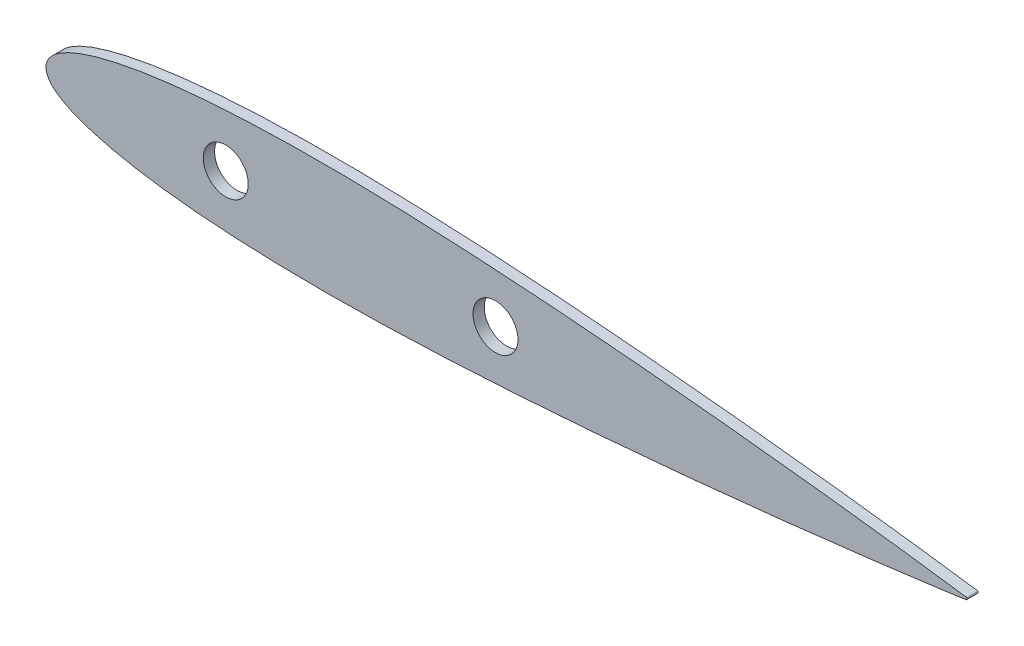
ISO-10303-21;
HEADER;
FILE_DESCRIPTION(('STEP AP214'),'2;1');
FILE_NAME('part.step','',(''),(''),'','','');
FILE_SCHEMA(('AUTOMOTIVE_DESIGN { 1 0 10303 214 1 1 1 1 }'));
ENDSEC;
DATA;
#1=APPLICATION_CONTEXT('core data for automotive mechanical design processes');
#2=APPLICATION_PROTOCOL_DEFINITION('international standard','automotive_design',2000,#1);
#3=PRODUCT_CONTEXT('',#1,'mechanical');
#4=PRODUCT('Part','Part','',(#3));
#5=PRODUCT_RELATED_PRODUCT_CATEGORY('part','',(#4));
#6=PRODUCT_DEFINITION_FORMATION('','',#4);
#7=PRODUCT_DEFINITION_CONTEXT('part definition',#1,'design');
#8=PRODUCT_DEFINITION('design','',#6,#7);
#9=PRODUCT_DEFINITION_SHAPE('','',#8);
#10=(LENGTH_UNIT() NAMED_UNIT(*) SI_UNIT(.MILLI.,.METRE.));
#11=(NAMED_UNIT(*) PLANE_ANGLE_UNIT() SI_UNIT($,.RADIAN.));
#12=(NAMED_UNIT(*) SI_UNIT($,.STERADIAN.) SOLID_ANGLE_UNIT());
#13=UNCERTAINTY_MEASURE_WITH_UNIT(LENGTH_MEASURE(1.E-05),#10,'distance_accuracy_value','');
#14=(GEOMETRIC_REPRESENTATION_CONTEXT(3) GLOBAL_UNCERTAINTY_ASSIGNED_CONTEXT((#13)) GLOBAL_UNIT_ASSIGNED_CONTEXT((#10,
#11,#12)) REPRESENTATION_CONTEXT('',''));
#15=CARTESIAN_POINT('',(0.,0.,0.));
#16=DIRECTION('',(0.,0.,1.));
#17=DIRECTION('',(1.,0.,0.));
#18=AXIS2_PLACEMENT_3D('',#15,#16,#17);
#19=CARTESIAN_POINT('',(260.0452,0.327656952,-3.175));
#20=CARTESIAN_POINT('',(259.948670784195,0.408549747677553,-3.175));
#21=CARTESIAN_POINT('',(259.324982782356,0.332171243642446,-3.175));
#22=CARTESIAN_POINT('',(258.214353737037,0.644814395811448,-3.175));
#23=CARTESIAN_POINT('',(256.177607818263,0.838056426580403,-3.175));
#24=CARTESIAN_POINT('',(253.433801737583,1.25277752465824,-3.175));
#25=CARTESIAN_POINT('',(249.899368468041,1.71557857177886,-3.175));
#26=CARTESIAN_POINT('',(245.637065084656,2.28595958580612,-3.175));
#27=CARTESIAN_POINT('',(240.657980822386,2.93072113615442,-3.175));
#28=CARTESIAN_POINT('',(234.998171456179,3.64857952743209,-3.175));
#29=CARTESIAN_POINT('',(228.690715213174,4.42695906665856,-3.175));
#30=CARTESIAN_POINT('',(221.775069318869,5.25532550511811,-3.175));
#31=CARTESIAN_POINT('',(214.293741917655,6.12340468130682,-3.175));
#32=CARTESIAN_POINT('',(206.292803306858,7.01937791457286,-3.175));
#33=CARTESIAN_POINT('',(197.821609940618,7.93230609702059,-3.175));
#34=CARTESIAN_POINT('',(188.932449451795,8.85085054367962,-3.175));
#35=CARTESIAN_POINT('',(179.680104845161,9.76315510334953,-3.175));
#36=CARTESIAN_POINT('',(170.121645127597,10.6564137604457,-3.175));
#37=CARTESIAN_POINT('',(160.31593543523,11.5188998721477,-3.175));
#38=CARTESIAN_POINT('',(150.323538425535,12.3361942143586,-3.175));
#39=CARTESIAN_POINT('',(140.205853007703,13.0949707702111,-3.175));
#40=CARTESIAN_POINT('',(130.025349996519,13.7811422475302,-3.175));
#41=CARTESIAN_POINT('',(119.844755531922,14.3803613927517,-3.175));
#42=CARTESIAN_POINT('',(109.726743668413,14.8774896895826,-3.175));
#43=CARTESIAN_POINT('',(99.7338029241543,15.2592707495278,-3.175));
#44=CARTESIAN_POINT('',(89.9272548198394,15.5132494411289,-3.175));
#45=CARTESIAN_POINT('',(80.3677018216292,15.6270204832243,-3.175));
#46=CARTESIAN_POINT('',(71.1138834274536,15.5915549578003,-3.175));
#47=CARTESIAN_POINT('',(62.2228518404941,15.4000024118945,-3.175));
#48=CARTESIAN_POINT('',(53.7493354187602,15.0475071978748,-3.175));
#49=CARTESIAN_POINT('',(45.7454902798497,14.5331472432107,-3.175));
#50=CARTESIAN_POINT('',(38.2605083474364,13.8584702230233,-3.175));
#51=CARTESIAN_POINT('',(31.3401923826809,13.0287453937439,-3.175));
#52=CARTESIAN_POINT('',(25.0267239290261,12.0510324856845,-3.175));
#53=CARTESIAN_POINT('',(19.3583610781161,10.935542874534,-3.175));
#54=CARTESIAN_POINT('',(14.3683268845989,9.69488969912896,-3.175));
#55=CARTESIAN_POINT('',(10.0849768876198,8.34117087505652,-3.175));
#56=CARTESIAN_POINT('',(6.53007331547073,6.88699441305538,-3.175));
#57=CARTESIAN_POINT('',(3.71495285454541,5.34219850051549,-3.175));
#58=CARTESIAN_POINT('',(1.64394730424783,3.70373418675639,-3.175));
#59=CARTESIAN_POINT('',(0.317485098892859,1.93196329690308,-3.175));
#60=CARTESIAN_POINT('',(-0.147959344049623,0.,-3.175));
#61=CARTESIAN_POINT('',(0.317485098892869,-1.9319632969031,-3.175));
#62=CARTESIAN_POINT('',(1.6439473042478,-3.70373418675636,-3.175));
#63=CARTESIAN_POINT('',(3.71495285454547,-5.34219850051553,-3.175));
#64=CARTESIAN_POINT('',(6.53007331547065,-6.88699441305534,-3.175));
#65=CARTESIAN_POINT('',(10.0849768876199,-8.34117087505654,-3.175));
#66=CARTESIAN_POINT('',(14.3683268845988,-9.69488969912895,-3.175));
#67=CARTESIAN_POINT('',(19.3583610781161,-10.935542874534,-3.175));
#68=CARTESIAN_POINT('',(25.0267239290261,-12.0510324856845,-3.175));
#69=CARTESIAN_POINT('',(31.3401923826808,-13.0287453937439,-3.175));
#70=CARTESIAN_POINT('',(38.2605083474364,-13.8584702230233,-3.175));
#71=CARTESIAN_POINT('',(45.7454902798497,-14.5331472432107,-3.175));
#72=CARTESIAN_POINT('',(53.7493354187601,-15.0475071978748,-3.175));
#73=CARTESIAN_POINT('',(62.2228518404942,-15.4000024118945,-3.175));
#74=CARTESIAN_POINT('',(71.1138834274535,-15.5915549578003,-3.175));
#75=CARTESIAN_POINT('',(80.3677018216292,-15.6270204832243,-3.175));
#76=CARTESIAN_POINT('',(89.9272548198394,-15.5132494411289,-3.175));
#77=CARTESIAN_POINT('',(99.7338029241543,-15.2592707495278,-3.175));
#78=CARTESIAN_POINT('',(109.726743668413,-14.8774896895826,-3.175));
#79=CARTESIAN_POINT('',(119.844755531922,-14.3803613927517,-3.175));
#80=CARTESIAN_POINT('',(130.025349996519,-13.7811422475302,-3.175));
#81=CARTESIAN_POINT('',(140.205853007703,-13.0949707702111,-3.175));
#82=CARTESIAN_POINT('',(150.323538425535,-12.3361942143586,-3.175));
#83=CARTESIAN_POINT('',(160.31593543523,-11.5188998721477,-3.175));
#84=CARTESIAN_POINT('',(170.121645127597,-10.6564137604457,-3.175));
#85=CARTESIAN_POINT('',(179.680104845161,-9.76315510334953,-3.175));
#86=CARTESIAN_POINT('',(188.932449451795,-8.85085054367962,-3.175));
#87=CARTESIAN_POINT('',(197.821609940618,-7.93230609702058,-3.175));
#88=CARTESIAN_POINT('',(206.292803306858,-7.01937791457287,-3.175));
#89=CARTESIAN_POINT('',(214.293741917655,-6.12340468130681,-3.175));
#90=CARTESIAN_POINT('',(221.775069318869,-5.25532550511811,-3.175));
#91=CARTESIAN_POINT('',(228.690715213174,-4.42695906665857,-3.175));
#92=CARTESIAN_POINT('',(234.998171456179,-3.64857952743208,-3.175));
#93=CARTESIAN_POINT('',(240.657980822386,-2.93072113615442,-3.175));
#94=CARTESIAN_POINT('',(245.637065084656,-2.28595958580612,-3.175));
#95=CARTESIAN_POINT('',(249.899368468041,-1.71557857177886,-3.175));
#96=CARTESIAN_POINT('',(253.433801737583,-1.25277752465823,-3.175));
#97=CARTESIAN_POINT('',(256.177607818263,-0.838056426580417,-3.175));
#98=CARTESIAN_POINT('',(258.214353737037,-0.644814395811427,-3.175));
#99=CARTESIAN_POINT('',(259.324982782355,-0.332171243642476,-3.175));
#100=CARTESIAN_POINT('',(260.201526154816,-0.43951509395358,-3.175));
#101=CARTESIAN_POINT('',(260.201526154815,0.196653508170601,-3.175));
#102=CARTESIAN_POINT('',(260.0452,0.327656952,-3.175));
#103=B_SPLINE_CURVE_WITH_KNOTS('',3,(#19,#20,#21,#22,#23,#24,#25,#26,#27,#28,#29,#30,#31,#32,
#33,#34,#35,#36,#37,#38,#39,#40,#41,#42,#43,#44,#45,#46,#47,#48,#49,#50,#51,#52,#53,#54,#55,#56,
#57,#58,#59,#60,#61,#62,#63,#64,#65,#66,#67,#68,#69,#70,#71,#72,#73,#74,#75,#76,#77,#78,#79,#80,
#81,#82,#83,#84,#85,#86,#87,#88,#89,#90,#91,#92,#93,#94,#95,#96,#97,#98,#99,#100,#101,#102),
.UNSPECIFIED.,.T.,.F.,(4,1,1,1,1,1,1,1,1,1,1,1,1,1,1,1,1,1,1,1,1,1,1,1,1,1,1,1,1,1,1,1,1,1,1,1,
1,1,1,1,1,1,1,1,1,1,1,1,1,1,1,1,1,1,1,1,1,1,1,1,1,1,1,1,1,1,1,1,1,1,1,1,1,1,1,1,1,1,1,1,1,4),
(0.,0.000762214745791682,0.00304470640558493,0.00683224554310989,0.0121011758037393,
0.0188175356586669,0.0269394547931034,0.0364148482585385,0.0471846285955787,0.0591804130997975,
0.0723278736138957,0.0865440610891321,0.101740580336537,0.117823336433559,0.134691452208308,
0.152240154447141,0.170361289964624,0.18894100784953,0.207865435445628,0.227016078022491,
0.246275695979991,0.265524943249886,0.284644966110435,0.303520118268654,0.322034575374324,
0.340078352914112,0.357542593241696,0.374325481920829,0.390329890871883,0.405463889739091,
0.419643801445681,0.432793371391337,0.444843816743184,0.455737920704732,0.465428653233083,
0.473886320085415,0.481101634077568,0.487101684418677,0.491975368345092,0.495930677807379,
0.499382808099288,0.502834938391198,0.506790247853484,0.511663931779899,0.517663982121009,
0.524879296113162,0.533336962965493,0.543027695493844,0.553921799455393,0.565972244807239,
0.579121814752895,0.593301726459485,0.608435725326693,0.624440134277747,0.64122302295688,
0.658687263284464,0.676731040824252,0.695245497929922,0.714120650088141,0.73324067294869,
0.752489920218586,0.771749538176086,0.790900180752948,0.809824608349046,0.828404326233953,
0.846525461751435,0.864074163990269,0.880942279765017,0.897025035862039,0.912221555109444,
0.92643774258468,0.939585203098779,0.951580987602998,0.962350767940038,0.971826161405473,
0.979948080539909,0.986664440394837,0.991933370655466,0.995720909792991,0.998003401452785,
0.998765616198576,1.),.UNSPECIFIED.);
#104=DIRECTION('',(0.,0.,1.));
#105=VECTOR('',#104,1.);
#106=SURFACE_OF_LINEAR_EXTRUSION('',#103,#105);
#107=CARTESIAN_POINT('',(260.0452,0.327656952,-3.175));
#108=VERTEX_POINT('',#107);
#109=EDGE_CURVE('E10',#108,#108,#103,.T.);
#110=ORIENTED_EDGE('',*,*,#109,.T.);
#111=EDGE_LOOP('',(#110));
#112=FACE_BOUND('',#111,.T.);
#113=CARTESIAN_POINT('',(260.0452,0.327656952,0.));
#114=CARTESIAN_POINT('',(259.948670784195,0.408549747677553,0.));
#115=CARTESIAN_POINT('',(259.324982782356,0.332171243642446,0.));
#116=CARTESIAN_POINT('',(258.214353737037,0.644814395811448,0.));
#117=CARTESIAN_POINT('',(256.177607818263,0.838056426580403,0.));
#118=CARTESIAN_POINT('',(253.433801737583,1.25277752465824,0.));
#119=CARTESIAN_POINT('',(249.899368468041,1.71557857177886,0.));
#120=CARTESIAN_POINT('',(245.637065084656,2.28595958580612,0.));
#121=CARTESIAN_POINT('',(240.657980822386,2.93072113615442,0.));
#122=CARTESIAN_POINT('',(234.998171456179,3.64857952743209,0.));
#123=CARTESIAN_POINT('',(228.690715213174,4.42695906665856,0.));
#124=CARTESIAN_POINT('',(221.775069318869,5.25532550511811,0.));
#125=CARTESIAN_POINT('',(214.293741917655,6.12340468130682,0.));
#126=CARTESIAN_POINT('',(206.292803306858,7.01937791457286,0.));
#127=CARTESIAN_POINT('',(197.821609940618,7.93230609702059,0.));
#128=CARTESIAN_POINT('',(188.932449451795,8.85085054367962,0.));
#129=CARTESIAN_POINT('',(179.680104845161,9.76315510334953,0.));
#130=CARTESIAN_POINT('',(170.121645127597,10.6564137604457,0.));
#131=CARTESIAN_POINT('',(160.31593543523,11.5188998721477,0.));
#132=CARTESIAN_POINT('',(150.323538425535,12.3361942143586,0.));
#133=CARTESIAN_POINT('',(140.205853007703,13.0949707702111,0.));
#134=CARTESIAN_POINT('',(130.025349996519,13.7811422475302,0.));
#135=CARTESIAN_POINT('',(119.844755531922,14.3803613927517,0.));
#136=CARTESIAN_POINT('',(109.726743668413,14.8774896895826,0.));
#137=CARTESIAN_POINT('',(99.7338029241543,15.2592707495278,0.));
#138=CARTESIAN_POINT('',(89.9272548198394,15.5132494411289,0.));
#139=CARTESIAN_POINT('',(80.3677018216292,15.6270204832243,0.));
#140=CARTESIAN_POINT('',(71.1138834274536,15.5915549578003,0.));
#141=CARTESIAN_POINT('',(62.2228518404941,15.4000024118945,0.));
#142=CARTESIAN_POINT('',(53.7493354187602,15.0475071978748,0.));
#143=CARTESIAN_POINT('',(45.7454902798497,14.5331472432107,0.));
#144=CARTESIAN_POINT('',(38.2605083474364,13.8584702230233,0.));
#145=CARTESIAN_POINT('',(31.3401923826809,13.0287453937439,0.));
#146=CARTESIAN_POINT('',(25.0267239290261,12.0510324856845,0.));
#147=CARTESIAN_POINT('',(19.3583610781161,10.935542874534,0.));
#148=CARTESIAN_POINT('',(14.3683268845989,9.69488969912896,0.));
#149=CARTESIAN_POINT('',(10.0849768876198,8.34117087505652,0.));
#150=CARTESIAN_POINT('',(6.53007331547073,6.88699441305538,0.));
#151=CARTESIAN_POINT('',(3.71495285454541,5.34219850051549,0.));
#152=CARTESIAN_POINT('',(1.64394730424783,3.70373418675639,0.));
#153=CARTESIAN_POINT('',(0.317485098892859,1.93196329690308,0.));
#154=CARTESIAN_POINT('',(-0.147959344049623,0.,0.));
#155=CARTESIAN_POINT('',(0.317485098892869,-1.9319632969031,0.));
#156=CARTESIAN_POINT('',(1.6439473042478,-3.70373418675636,0.));
#157=CARTESIAN_POINT('',(3.71495285454547,-5.34219850051553,0.));
#158=CARTESIAN_POINT('',(6.53007331547065,-6.88699441305534,0.));
#159=CARTESIAN_POINT('',(10.0849768876199,-8.34117087505654,0.));
#160=CARTESIAN_POINT('',(14.3683268845988,-9.69488969912895,0.));
#161=CARTESIAN_POINT('',(19.3583610781161,-10.935542874534,0.));
#162=CARTESIAN_POINT('',(25.0267239290261,-12.0510324856845,0.));
#163=CARTESIAN_POINT('',(31.3401923826808,-13.0287453937439,0.));
#164=CARTESIAN_POINT('',(38.2605083474364,-13.8584702230233,0.));
#165=CARTESIAN_POINT('',(45.7454902798497,-14.5331472432107,0.));
#166=CARTESIAN_POINT('',(53.7493354187601,-15.0475071978748,0.));
#167=CARTESIAN_POINT('',(62.2228518404942,-15.4000024118945,0.));
#168=CARTESIAN_POINT('',(71.1138834274535,-15.5915549578003,0.));
#169=CARTESIAN_POINT('',(80.3677018216292,-15.6270204832243,0.));
#170=CARTESIAN_POINT('',(89.9272548198394,-15.5132494411289,0.));
#171=CARTESIAN_POINT('',(99.7338029241543,-15.2592707495278,0.));
#172=CARTESIAN_POINT('',(109.726743668413,-14.8774896895826,0.));
#173=CARTESIAN_POINT('',(119.844755531922,-14.3803613927517,0.));
#174=CARTESIAN_POINT('',(130.025349996519,-13.7811422475302,0.));
#175=CARTESIAN_POINT('',(140.205853007703,-13.0949707702111,0.));
#176=CARTESIAN_POINT('',(150.323538425535,-12.3361942143586,0.));
#177=CARTESIAN_POINT('',(160.31593543523,-11.5188998721477,0.));
#178=CARTESIAN_POINT('',(170.121645127597,-10.6564137604457,0.));
#179=CARTESIAN_POINT('',(179.680104845161,-9.76315510334953,0.));
#180=CARTESIAN_POINT('',(188.932449451795,-8.85085054367962,0.));
#181=CARTESIAN_POINT('',(197.821609940618,-7.93230609702058,0.));
#182=CARTESIAN_POINT('',(206.292803306858,-7.01937791457287,0.));
#183=CARTESIAN_POINT('',(214.293741917655,-6.12340468130681,0.));
#184=CARTESIAN_POINT('',(221.775069318869,-5.25532550511811,0.));
#185=CARTESIAN_POINT('',(228.690715213174,-4.42695906665857,0.));
#186=CARTESIAN_POINT('',(234.998171456179,-3.64857952743208,0.));
#187=CARTESIAN_POINT('',(240.657980822386,-2.93072113615442,0.));
#188=CARTESIAN_POINT('',(245.637065084656,-2.28595958580612,0.));
#189=CARTESIAN_POINT('',(249.899368468041,-1.71557857177886,0.));
#190=CARTESIAN_POINT('',(253.433801737583,-1.25277752465823,0.));
#191=CARTESIAN_POINT('',(256.177607818263,-0.838056426580417,0.));
#192=CARTESIAN_POINT('',(258.214353737037,-0.644814395811427,0.));
#193=CARTESIAN_POINT('',(259.324982782355,-0.332171243642476,0.));
#194=CARTESIAN_POINT('',(260.201526154816,-0.43951509395358,0.));
#195=CARTESIAN_POINT('',(260.201526154815,0.196653508170601,0.));
#196=CARTESIAN_POINT('',(260.0452,0.327656952,0.));
#197=B_SPLINE_CURVE_WITH_KNOTS('',3,(#113,#114,#115,#116,#117,#118,#119,#120,#121,#122,#123,
#124,#125,#126,#127,#128,#129,#130,#131,#132,#133,#134,#135,#136,#137,#138,#139,#140,#141,#142,
#143,#144,#145,#146,#147,#148,#149,#150,#151,#152,#153,#154,#155,#156,#157,#158,#159,#160,#161,
#162,#163,#164,#165,#166,#167,#168,#169,#170,#171,#172,#173,#174,#175,#176,#177,#178,#179,#180,
#181,#182,#183,#184,#185,#186,#187,#188,#189,#190,#191,#192,#193,#194,#195,#196),.UNSPECIFIED.,
.T.,.F.,(4,1,1,1,1,1,1,1,1,1,1,1,1,1,1,1,1,1,1,1,1,1,1,1,1,1,1,1,1,1,1,1,1,1,1,1,1,1,1,1,1,1,1,
1,1,1,1,1,1,1,1,1,1,1,1,1,1,1,1,1,1,1,1,1,1,1,1,1,1,1,1,1,1,1,1,1,1,1,1,1,1,4),(0.,
0.000762214745791682,0.00304470640558493,0.00683224554310989,0.0121011758037393,
0.0188175356586669,0.0269394547931034,0.0364148482585385,0.0471846285955787,0.0591804130997975,
0.0723278736138957,0.0865440610891321,0.101740580336537,0.117823336433559,0.134691452208308,
0.152240154447141,0.170361289964624,0.18894100784953,0.207865435445628,0.227016078022491,
0.246275695979991,0.265524943249886,0.284644966110435,0.303520118268654,0.322034575374324,
0.340078352914112,0.357542593241696,0.374325481920829,0.390329890871883,0.405463889739091,
0.419643801445681,0.432793371391337,0.444843816743184,0.455737920704732,0.465428653233083,
0.473886320085415,0.481101634077568,0.487101684418677,0.491975368345092,0.495930677807379,
0.499382808099288,0.502834938391198,0.506790247853484,0.511663931779899,0.517663982121009,
0.524879296113162,0.533336962965493,0.543027695493844,0.553921799455393,0.565972244807239,
0.579121814752895,0.593301726459485,0.608435725326693,0.624440134277747,0.64122302295688,
0.658687263284464,0.676731040824252,0.695245497929922,0.714120650088141,0.73324067294869,
0.752489920218586,0.771749538176086,0.790900180752948,0.809824608349046,0.828404326233953,
0.846525461751435,0.864074163990269,0.880942279765017,0.897025035862039,0.912221555109444,
0.92643774258468,0.939585203098779,0.951580987602998,0.962350767940038,0.971826161405473,
0.979948080539909,0.986664440394837,0.991933370655466,0.995720909792991,0.998003401452785,
0.998765616198576,1.),.UNSPECIFIED.);
#198=CARTESIAN_POINT('',(260.0452,0.327656952,0.));
#199=VERTEX_POINT('',#198);
#200=EDGE_CURVE('E39',#199,#199,#197,.T.);
#201=ORIENTED_EDGE('',*,*,#200,.F.);
#202=EDGE_LOOP('',(#201));
#203=FACE_BOUND('',#202,.T.);
#204=ADVANCED_FACE('F35',(#112,#203),#106,.T.);
#205=CARTESIAN_POINT('',(0.0139416960998667,-0.32909387028347,-3.175));
#206=DIRECTION('',(0.,0.,1.));
#207=DIRECTION('',(-1.,0.,0.));
#208=AXIS2_PLACEMENT_3D('',#205,#206,#207);
#209=PLANE('',#208);
#210=CARTESIAN_POINT('',(50.8,0.,-3.175));
#211=DIRECTION('',(0.,0.,1.));
#212=DIRECTION('',(1.,0.,0.));
#213=AXIS2_PLACEMENT_3D('',#210,#211,#212);
#214=CIRCLE('',#213,6.35);
#215=CARTESIAN_POINT('',(57.15,0.,-3.175));
#216=VERTEX_POINT('',#215);
#217=EDGE_CURVE('E61',#216,#216,#214,.T.);
#218=ORIENTED_EDGE('',*,*,#217,.T.);
#219=EDGE_LOOP('',(#218));
#220=FACE_BOUND('',#219,.T.);
#221=CARTESIAN_POINT('',(127.,0.,-3.175));
#222=DIRECTION('',(0.,0.,1.));
#223=DIRECTION('',(1.,0.,0.));
#224=AXIS2_PLACEMENT_3D('',#221,#222,#223);
#225=CIRCLE('',#224,6.35);
#226=CARTESIAN_POINT('',(133.35,0.,-3.175));
#227=VERTEX_POINT('',#226);
#228=EDGE_CURVE('E52',#227,#227,#225,.T.);
#229=ORIENTED_EDGE('',*,*,#228,.T.);
#230=EDGE_LOOP('',(#229));
#231=FACE_BOUND('',#230,.T.);
#232=ORIENTED_EDGE('',*,*,#109,.F.);
#233=EDGE_LOOP('',(#232));
#234=FACE_BOUND('',#233,.T.);
#235=ADVANCED_FACE('F74',(#220,#231,#234),#209,.F.);
#236=CARTESIAN_POINT('',(0.0139416960998667,-0.32909387028347,0.));
#237=DIRECTION('',(0.,0.,1.));
#238=DIRECTION('',(-1.,0.,0.));
#239=AXIS2_PLACEMENT_3D('',#236,#237,#238);
#240=PLANE('',#239);
#241=CARTESIAN_POINT('',(50.8,0.,0.));
#242=DIRECTION('',(0.,0.,1.));
#243=DIRECTION('',(1.,0.,0.));
#244=AXIS2_PLACEMENT_3D('',#241,#242,#243);
#245=CIRCLE('',#244,6.35);
#246=CARTESIAN_POINT('',(57.15,0.,0.));
#247=VERTEX_POINT('',#246);
#248=EDGE_CURVE('E47',#247,#247,#245,.T.);
#249=ORIENTED_EDGE('',*,*,#248,.F.);
#250=EDGE_LOOP('',(#249));
#251=FACE_BOUND('',#250,.T.);
#252=CARTESIAN_POINT('',(127.,0.,0.));
#253=DIRECTION('',(0.,0.,1.));
#254=DIRECTION('',(1.,0.,0.));
#255=AXIS2_PLACEMENT_3D('',#252,#253,#254);
#256=CIRCLE('',#255,6.35);
#257=CARTESIAN_POINT('',(133.35,0.,0.));
#258=VERTEX_POINT('',#257);
#259=EDGE_CURVE('E58',#258,#258,#256,.T.);
#260=ORIENTED_EDGE('',*,*,#259,.F.);
#261=EDGE_LOOP('',(#260));
#262=FACE_BOUND('',#261,.T.);
#263=ORIENTED_EDGE('',*,*,#200,.T.);
#264=EDGE_LOOP('',(#263));
#265=FACE_BOUND('',#264,.T.);
#266=ADVANCED_FACE('F70',(#251,#262,#265),#240,.T.);
#267=CARTESIAN_POINT('',(127.,0.,0.));
#268=DIRECTION('',(0.,0.,-1.));
#269=DIRECTION('',(1.,0.,0.));
#270=AXIS2_PLACEMENT_3D('',#267,#268,#269);
#271=CYLINDRICAL_SURFACE('',#270,6.35);
#272=ORIENTED_EDGE('',*,*,#259,.T.);
#273=EDGE_LOOP('',(#272));
#274=FACE_BOUND('',#273,.T.);
#275=ORIENTED_EDGE('',*,*,#228,.F.);
#276=EDGE_LOOP('',(#275));
#277=FACE_BOUND('',#276,.T.);
#278=ADVANCED_FACE('F73',(#274,#277),#271,.F.);
#279=CARTESIAN_POINT('',(50.8,0.,0.));
#280=DIRECTION('',(0.,0.,-1.));
#281=DIRECTION('',(1.,0.,0.));
#282=AXIS2_PLACEMENT_3D('',#279,#280,#281);
#283=CYLINDRICAL_SURFACE('',#282,6.35);
#284=ORIENTED_EDGE('',*,*,#248,.T.);
#285=EDGE_LOOP('',(#284));
#286=FACE_BOUND('',#285,.T.);
#287=ORIENTED_EDGE('',*,*,#217,.F.);
#288=EDGE_LOOP('',(#287));
#289=FACE_BOUND('',#288,.T.);
#290=ADVANCED_FACE('F67',(#286,#289),#283,.F.);
#291=CLOSED_SHELL('',(#204,#235,#266,#278,#290));
#292=MANIFOLD_SOLID_BREP('B2',#291);
#293=ADVANCED_BREP_SHAPE_REPRESENTATION('',(#18,#292),#14);
#294=SHAPE_DEFINITION_REPRESENTATION(#9,#293);
ENDSEC;
END-ISO-10303-21;
